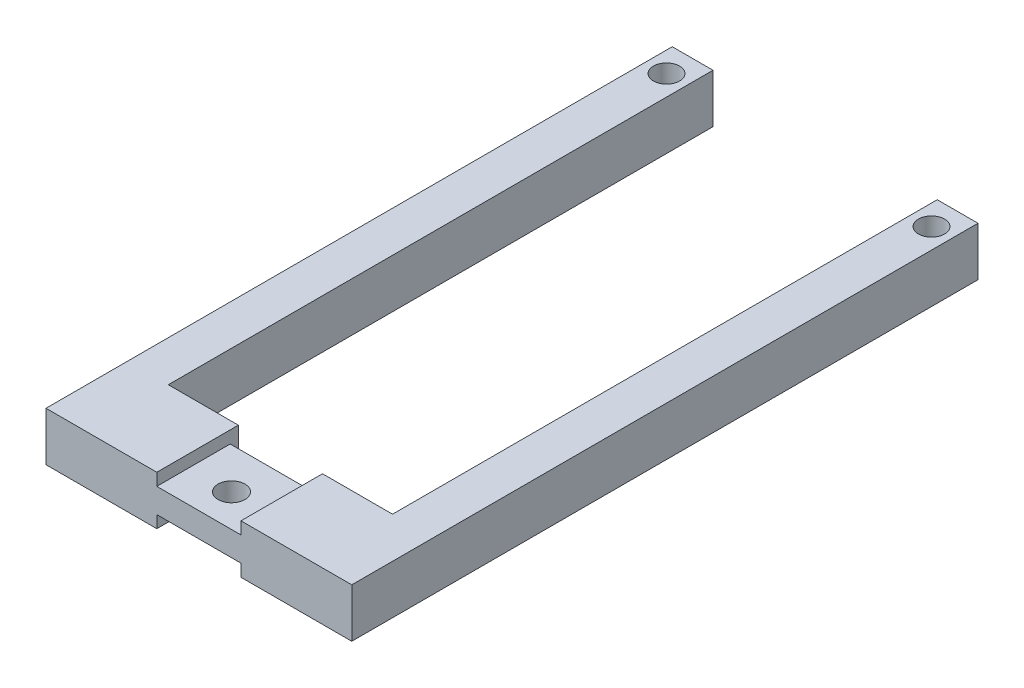
ISO-10303-21;
HEADER;
FILE_DESCRIPTION(('STEP AP214'),'2;1');
FILE_NAME('part.step','',(''),(''),'','','');
FILE_SCHEMA(('AUTOMOTIVE_DESIGN { 1 0 10303 214 1 1 1 1 }'));
ENDSEC;
DATA;
#1=APPLICATION_CONTEXT('core data for automotive mechanical design processes');
#2=APPLICATION_PROTOCOL_DEFINITION('international standard','automotive_design',2000,#1);
#3=PRODUCT_CONTEXT('',#1,'mechanical');
#4=PRODUCT('Part','Part','',(#3));
#5=PRODUCT_RELATED_PRODUCT_CATEGORY('part','',(#4));
#6=PRODUCT_DEFINITION_FORMATION('','',#4);
#7=PRODUCT_DEFINITION_CONTEXT('part definition',#1,'design');
#8=PRODUCT_DEFINITION('design','',#6,#7);
#9=PRODUCT_DEFINITION_SHAPE('','',#8);
#10=(LENGTH_UNIT() NAMED_UNIT(*) SI_UNIT(.MILLI.,.METRE.));
#11=(NAMED_UNIT(*) PLANE_ANGLE_UNIT() SI_UNIT($,.RADIAN.));
#12=(NAMED_UNIT(*) SI_UNIT($,.STERADIAN.) SOLID_ANGLE_UNIT());
#13=UNCERTAINTY_MEASURE_WITH_UNIT(LENGTH_MEASURE(1.E-05),#10,'distance_accuracy_value','');
#14=(GEOMETRIC_REPRESENTATION_CONTEXT(3) GLOBAL_UNCERTAINTY_ASSIGNED_CONTEXT((#13)) GLOBAL_UNIT_ASSIGNED_CONTEXT((#10,
#11,#12)) REPRESENTATION_CONTEXT('',''));
#15=CARTESIAN_POINT('',(0.,0.,0.));
#16=DIRECTION('',(0.,0.,1.));
#17=DIRECTION('',(1.,0.,0.));
#18=AXIS2_PLACEMENT_3D('',#15,#16,#17);
#19=CARTESIAN_POINT('',(-30.5506720736389,8.,45.431484198975));
#20=DIRECTION('',(0.,0.,1.));
#21=DIRECTION('',(1.,0.,0.));
#22=AXIS2_PLACEMENT_3D('',#19,#20,#21);
#23=PLANE('',#22);
#24=DIRECTION('',(0.,-1.,0.));
#25=VECTOR('',#24,1.);
#26=CARTESIAN_POINT('',(-30.5506720736389,8.,45.431484198975));
#27=LINE('',#26,#25);
#28=CARTESIAN_POINT('',(-30.5506720736389,5.5,45.431484198975));
#29=VERTEX_POINT('',#28);
#30=CARTESIAN_POINT('',(-30.5506720736389,2.5,45.431484198975));
#31=VERTEX_POINT('',#30);
#32=EDGE_CURVE('E193',#29,#31,#27,.T.);
#33=ORIENTED_EDGE('',*,*,#32,.F.);
#34=DIRECTION('',(1.,0.,0.));
#35=VECTOR('',#34,1.);
#36=CARTESIAN_POINT('',(-30.5506720736389,5.5,45.431484198975));
#37=LINE('',#36,#35);
#38=CARTESIAN_POINT('',(-20.2306720736389,5.5,45.431484198975));
#39=VERTEX_POINT('',#38);
#40=EDGE_CURVE('E260',#29,#39,#37,.T.);
#41=ORIENTED_EDGE('',*,*,#40,.T.);
#42=DIRECTION('',(0.,-1.,0.));
#43=VECTOR('',#42,1.);
#44=CARTESIAN_POINT('',(-20.2306720736389,8.,45.431484198975));
#45=LINE('',#44,#43);
#46=CARTESIAN_POINT('',(-20.2306720736389,2.5,45.431484198975));
#47=VERTEX_POINT('',#46);
#48=EDGE_CURVE('E187',#39,#47,#45,.T.);
#49=ORIENTED_EDGE('',*,*,#48,.T.);
#50=DIRECTION('',(-1.,0.,0.));
#51=VECTOR('',#50,1.);
#52=CARTESIAN_POINT('',(-30.5506720736389,2.5,45.431484198975));
#53=LINE('',#52,#51);
#54=EDGE_CURVE('E268',#47,#31,#53,.T.);
#55=ORIENTED_EDGE('',*,*,#54,.T.);
#56=EDGE_LOOP('',(#33,#41,#49,#55));
#57=FACE_BOUND('',#56,.T.);
#58=ADVANCED_FACE('F45',(#57),#23,.F.);
#59=CARTESIAN_POINT('',(-42.8906720736389,8.,54.431484198975));
#60=DIRECTION('',(0.,0.,-1.));
#61=DIRECTION('',(-1.,0.,0.));
#62=AXIS2_PLACEMENT_3D('',#59,#60,#61);
#63=PLANE('',#62);
#64=DIRECTION('',(1.,0.,0.));
#65=VECTOR('',#64,1.);
#66=CARTESIAN_POINT('',(-44.8906720736389,0.999999999999991,54.431484198975));
#67=LINE('',#66,#65);
#68=CARTESIAN_POINT('',(-20.2306720736389,0.999999999999991,54.431484198975));
#69=VERTEX_POINT('',#68);
#70=CARTESIAN_POINT('',(-6.64067207363894,0.999999999999987,54.431484198975));
#71=VERTEX_POINT('',#70);
#72=EDGE_CURVE('E249',#69,#71,#67,.T.);
#73=ORIENTED_EDGE('',*,*,#72,.T.);
#74=DIRECTION('',(0.,1.,0.));
#75=VECTOR('',#74,1.);
#76=CARTESIAN_POINT('',(-6.64067207363894,-75.8036620220677,54.431484198975));
#77=LINE('',#76,#75);
#78=CARTESIAN_POINT('',(-6.64067207363894,7.,54.431484198975));
#79=VERTEX_POINT('',#78);
#80=EDGE_CURVE('E317',#71,#79,#77,.T.);
#81=ORIENTED_EDGE('',*,*,#80,.T.);
#82=DIRECTION('',(1.,0.,0.));
#83=VECTOR('',#82,1.);
#84=CARTESIAN_POINT('',(-44.8906720736389,7.,54.431484198975));
#85=LINE('',#84,#83);
#86=CARTESIAN_POINT('',(-20.2306720736389,7.,54.431484198975));
#87=VERTEX_POINT('',#86);
#88=EDGE_CURVE('E253',#87,#79,#85,.T.);
#89=ORIENTED_EDGE('',*,*,#88,.F.);
#90=DIRECTION('',(0.,1.,0.));
#91=VECTOR('',#90,1.);
#92=CARTESIAN_POINT('',(-20.2306720736389,5.6,54.431484198975));
#93=LINE('',#92,#91);
#94=CARTESIAN_POINT('',(-20.2306720736389,5.5,54.431484198975));
#95=VERTEX_POINT('',#94);
#96=EDGE_CURVE('E200',#95,#87,#93,.T.);
#97=ORIENTED_EDGE('',*,*,#96,.F.);
#98=DIRECTION('',(1.,0.,0.));
#99=VECTOR('',#98,1.);
#100=CARTESIAN_POINT('',(-30.5506720736389,5.5,54.431484198975));
#101=LINE('',#100,#99);
#102=CARTESIAN_POINT('',(-30.5506720736389,5.5,54.431484198975));
#103=VERTEX_POINT('',#102);
#104=EDGE_CURVE('E281',#103,#95,#101,.T.);
#105=ORIENTED_EDGE('',*,*,#104,.F.);
#106=DIRECTION('',(0.,1.,0.));
#107=VECTOR('',#106,1.);
#108=CARTESIAN_POINT('',(-30.5506720736389,5.6,54.431484198975));
#109=LINE('',#108,#107);
#110=CARTESIAN_POINT('',(-30.5506720736389,7.,54.431484198975));
#111=VERTEX_POINT('',#110);
#112=EDGE_CURVE('E201',#103,#111,#109,.T.);
#113=ORIENTED_EDGE('',*,*,#112,.T.);
#114=CARTESIAN_POINT('',(-44.1406720736389,7.,54.431484198975));
#115=VERTEX_POINT('',#114);
#116=EDGE_CURVE('E254',#115,#111,#85,.T.);
#117=ORIENTED_EDGE('',*,*,#116,.F.);
#118=DIRECTION('',(0.,1.,0.));
#119=VECTOR('',#118,1.);
#120=CARTESIAN_POINT('',(-44.1406720736389,-75.8036620220677,54.431484198975));
#121=LINE('',#120,#119);
#122=CARTESIAN_POINT('',(-44.1406720736389,0.999999999999987,54.431484198975));
#123=VERTEX_POINT('',#122);
#124=EDGE_CURVE('E69',#123,#115,#121,.T.);
#125=ORIENTED_EDGE('',*,*,#124,.F.);
#126=CARTESIAN_POINT('',(-30.5506720736389,0.999999999999991,54.431484198975));
#127=VERTEX_POINT('',#126);
#128=EDGE_CURVE('E245',#123,#127,#67,.T.);
#129=ORIENTED_EDGE('',*,*,#128,.T.);
#130=DIRECTION('',(0.,-1.,0.));
#131=VECTOR('',#130,1.);
#132=CARTESIAN_POINT('',(-30.5506720736389,2.4,54.431484198975));
#133=LINE('',#132,#131);
#134=CARTESIAN_POINT('',(-30.5506720736389,2.5,54.431484198975));
#135=VERTEX_POINT('',#134);
#136=EDGE_CURVE('E205',#135,#127,#133,.T.);
#137=ORIENTED_EDGE('',*,*,#136,.F.);
#138=DIRECTION('',(-1.,0.,0.));
#139=VECTOR('',#138,1.);
#140=CARTESIAN_POINT('',(-30.5506720736389,2.5,54.431484198975));
#141=LINE('',#140,#139);
#142=CARTESIAN_POINT('',(-20.2306720736389,2.5,54.431484198975));
#143=VERTEX_POINT('',#142);
#144=EDGE_CURVE('E277',#143,#135,#141,.T.);
#145=ORIENTED_EDGE('',*,*,#144,.F.);
#146=DIRECTION('',(0.,-1.,0.));
#147=VECTOR('',#146,1.);
#148=CARTESIAN_POINT('',(-20.2306720736389,2.4,54.431484198975));
#149=LINE('',#148,#147);
#150=EDGE_CURVE('E209',#143,#69,#149,.T.);
#151=ORIENTED_EDGE('',*,*,#150,.T.);
#152=EDGE_LOOP('',(#73,#81,#89,#97,#105,#113,#117,#125,#129,#137,#145,#151));
#153=FACE_BOUND('',#152,.T.);
#154=ADVANCED_FACE('F47',(#153),#63,.F.);
#155=CARTESIAN_POINT('',(-20.2306720736389,8.,44.431484198975));
#156=DIRECTION('',(0.,0.,1.));
#157=DIRECTION('',(1.,0.,0.));
#158=AXIS2_PLACEMENT_3D('',#155,#156,#157);
#159=PLANE('',#158);
#160=DIRECTION('',(0.,-1.,0.));
#161=VECTOR('',#160,1.);
#162=CARTESIAN_POINT('',(-20.2306720736389,8.,44.431484198975));
#163=LINE('',#162,#161);
#164=CARTESIAN_POINT('',(-20.2306720736389,7.,44.431484198975));
#165=VERTEX_POINT('',#164);
#166=CARTESIAN_POINT('',(-20.2306720736389,0.99999999999999,44.431484198975));
#167=VERTEX_POINT('',#166);
#168=EDGE_CURVE('E185',#165,#167,#163,.T.);
#169=ORIENTED_EDGE('',*,*,#168,.F.);
#170=DIRECTION('',(1.,0.,0.));
#171=VECTOR('',#170,1.);
#172=CARTESIAN_POINT('',(-20.2306720736389,7.,44.431484198975));
#173=LINE('',#172,#171);
#174=CARTESIAN_POINT('',(-11.6406720736389,7.,44.431484198975));
#175=VERTEX_POINT('',#174);
#176=EDGE_CURVE('E213',#165,#175,#173,.T.);
#177=ORIENTED_EDGE('',*,*,#176,.T.);
#178=DIRECTION('',(0.,1.,0.));
#179=VECTOR('',#178,1.);
#180=CARTESIAN_POINT('',(-11.6406720736389,-75.8036620220677,44.431484198975));
#181=LINE('',#180,#179);
#182=CARTESIAN_POINT('',(-11.6406720736389,0.999999999999987,44.431484198975));
#183=VERTEX_POINT('',#182);
#184=EDGE_CURVE('E171',#183,#175,#181,.T.);
#185=ORIENTED_EDGE('',*,*,#184,.F.);
#186=DIRECTION('',(-1.,0.,0.));
#187=VECTOR('',#186,1.);
#188=CARTESIAN_POINT('',(-20.2306720736389,0.99999999999999,44.431484198975));
#189=LINE('',#188,#187);
#190=EDGE_CURVE('E179',#183,#167,#189,.T.);
#191=ORIENTED_EDGE('',*,*,#190,.T.);
#192=EDGE_LOOP('',(#169,#177,#185,#191));
#193=FACE_BOUND('',#192,.T.);
#194=ADVANCED_FACE('F413',(#193),#159,.F.);
#195=CARTESIAN_POINT('',(-20.2306720736389,8.,45.431484198975));
#196=DIRECTION('',(1.,0.,0.));
#197=DIRECTION('',(0.,0.,-1.));
#198=AXIS2_PLACEMENT_3D('',#195,#196,#197);
#199=PLANE('',#198);
#200=ORIENTED_EDGE('',*,*,#48,.F.);
#201=DIRECTION('',(0.,0.,1.));
#202=VECTOR('',#201,1.);
#203=CARTESIAN_POINT('',(-20.2306720736389,5.5,44.431484198975));
#204=LINE('',#203,#202);
#205=EDGE_CURVE('E276',#39,#95,#204,.T.);
#206=ORIENTED_EDGE('',*,*,#205,.T.);
#207=ORIENTED_EDGE('',*,*,#96,.T.);
#208=DIRECTION('',(0.,0.,-1.));
#209=VECTOR('',#208,1.);
#210=CARTESIAN_POINT('',(-20.2306720736389,7.,45.431484198975));
#211=LINE('',#210,#209);
#212=EDGE_CURVE('E219',#87,#165,#211,.T.);
#213=ORIENTED_EDGE('',*,*,#212,.T.);
#214=ORIENTED_EDGE('',*,*,#168,.T.);
#215=DIRECTION('',(0.,0.,1.));
#216=VECTOR('',#215,1.);
#217=CARTESIAN_POINT('',(-20.2306720736389,0.99999999999999,45.431484198975));
#218=LINE('',#217,#216);
#219=EDGE_CURVE('E233',#167,#69,#218,.T.);
#220=ORIENTED_EDGE('',*,*,#219,.T.);
#221=ORIENTED_EDGE('',*,*,#150,.F.);
#222=DIRECTION('',(0.,0.,1.));
#223=VECTOR('',#222,1.);
#224=CARTESIAN_POINT('',(-20.2306720736389,2.5,44.431484198975));
#225=LINE('',#224,#223);
#226=EDGE_CURVE('E282',#47,#143,#225,.T.);
#227=ORIENTED_EDGE('',*,*,#226,.F.);
#228=EDGE_LOOP('',(#200,#206,#207,#213,#214,#220,#221,#227));
#229=FACE_BOUND('',#228,.T.);
#230=ADVANCED_FACE('F418',(#229),#199,.F.);
#231=CARTESIAN_POINT('',(-30.5506720736389,8.,44.431484198975));
#232=DIRECTION('',(-1.,0.,0.));
#233=DIRECTION('',(0.,0.,1.));
#234=AXIS2_PLACEMENT_3D('',#231,#232,#233);
#235=PLANE('',#234);
#236=DIRECTION('',(0.,0.,1.));
#237=VECTOR('',#236,1.);
#238=CARTESIAN_POINT('',(-30.5506720736389,5.5,44.431484198975));
#239=LINE('',#238,#237);
#240=EDGE_CURVE('E291',#29,#103,#239,.T.);
#241=ORIENTED_EDGE('',*,*,#240,.F.);
#242=ORIENTED_EDGE('',*,*,#32,.T.);
#243=DIRECTION('',(0.,0.,1.));
#244=VECTOR('',#243,1.);
#245=CARTESIAN_POINT('',(-30.5506720736389,2.5,44.431484198975));
#246=LINE('',#245,#244);
#247=EDGE_CURVE('E283',#31,#135,#246,.T.);
#248=ORIENTED_EDGE('',*,*,#247,.T.);
#249=ORIENTED_EDGE('',*,*,#136,.T.);
#250=DIRECTION('',(0.,0.,-1.));
#251=VECTOR('',#250,1.);
#252=CARTESIAN_POINT('',(-30.5506720736389,0.99999999999999,44.431484198975));
#253=LINE('',#252,#251);
#254=CARTESIAN_POINT('',(-30.5506720736389,0.99999999999999,44.431484198975));
#255=VERTEX_POINT('',#254);
#256=EDGE_CURVE('E237',#127,#255,#253,.T.);
#257=ORIENTED_EDGE('',*,*,#256,.T.);
#258=DIRECTION('',(0.,-1.,0.));
#259=VECTOR('',#258,1.);
#260=CARTESIAN_POINT('',(-30.5506720736389,8.,44.431484198975));
#261=LINE('',#260,#259);
#262=CARTESIAN_POINT('',(-30.5506720736389,7.,44.431484198975));
#263=VERTEX_POINT('',#262);
#264=EDGE_CURVE('E197',#263,#255,#261,.T.);
#265=ORIENTED_EDGE('',*,*,#264,.F.);
#266=DIRECTION('',(0.,0.,1.));
#267=VECTOR('',#266,1.);
#268=CARTESIAN_POINT('',(-30.5506720736389,7.,44.431484198975));
#269=LINE('',#268,#267);
#270=EDGE_CURVE('E223',#263,#111,#269,.T.);
#271=ORIENTED_EDGE('',*,*,#270,.T.);
#272=ORIENTED_EDGE('',*,*,#112,.F.);
#273=EDGE_LOOP('',(#241,#242,#248,#249,#257,#265,#271,#272));
#274=FACE_BOUND('',#273,.T.);
#275=ADVANCED_FACE('F382',(#274),#235,.F.);
#276=CARTESIAN_POINT('',(-37.8906720736389,8.,44.431484198975));
#277=DIRECTION('',(0.,0.,1.));
#278=DIRECTION('',(1.,0.,0.));
#279=AXIS2_PLACEMENT_3D('',#276,#277,#278);
#280=PLANE('',#279);
#281=DIRECTION('',(-1.,0.,0.));
#282=VECTOR('',#281,1.);
#283=CARTESIAN_POINT('',(-37.8906720736389,0.99999999999999,44.431484198975));
#284=LINE('',#283,#282);
#285=CARTESIAN_POINT('',(-39.1406720736389,0.999999999999987,44.431484198975));
#286=VERTEX_POINT('',#285);
#287=EDGE_CURVE('E241',#255,#286,#284,.T.);
#288=ORIENTED_EDGE('',*,*,#287,.T.);
#289=DIRECTION('',(0.,1.,0.));
#290=VECTOR('',#289,1.);
#291=CARTESIAN_POINT('',(-39.1406720736389,-75.8036620220677,44.431484198975));
#292=LINE('',#291,#290);
#293=CARTESIAN_POINT('',(-39.1406720736389,7.,44.431484198975));
#294=VERTEX_POINT('',#293);
#295=EDGE_CURVE('E304',#286,#294,#292,.T.);
#296=ORIENTED_EDGE('',*,*,#295,.T.);
#297=DIRECTION('',(1.,0.,0.));
#298=VECTOR('',#297,1.);
#299=CARTESIAN_POINT('',(-37.8906720736389,7.,44.431484198975));
#300=LINE('',#299,#298);
#301=EDGE_CURVE('E227',#294,#263,#300,.T.);
#302=ORIENTED_EDGE('',*,*,#301,.T.);
#303=ORIENTED_EDGE('',*,*,#264,.T.);
#304=EDGE_LOOP('',(#288,#296,#302,#303));
#305=FACE_BOUND('',#304,.T.);
#306=ADVANCED_FACE('F384',(#305),#280,.F.);
#307=CARTESIAN_POINT('',(-44.8906720736389,85.1183506047685,-22.368515801025));
#308=DIRECTION('',(0.,0.,-1.));
#309=DIRECTION('',(-1.,0.,0.));
#310=AXIS2_PLACEMENT_3D('',#307,#308,#309);
#311=PLANE('',#310);
#312=DIRECTION('',(0.,1.,0.));
#313=VECTOR('',#312,1.);
#314=CARTESIAN_POINT('',(-44.1406720736389,-75.8036620220677,-22.368515801025));
#315=LINE('',#314,#313);
#316=CARTESIAN_POINT('',(-44.1406720736389,0.999999999999987,-22.368515801025));
#317=VERTEX_POINT('',#316);
#318=CARTESIAN_POINT('',(-44.1406720736389,7.,-22.368515801025));
#319=VERTEX_POINT('',#318);
#320=EDGE_CURVE('E330',#317,#319,#315,.T.);
#321=ORIENTED_EDGE('',*,*,#320,.T.);
#322=DIRECTION('',(1.,0.,0.));
#323=VECTOR('',#322,1.);
#324=CARTESIAN_POINT('',(-44.8906720736389,7.,-22.368515801025));
#325=LINE('',#324,#323);
#326=CARTESIAN_POINT('',(-39.140672073639,7.,-22.368515801025));
#327=VERTEX_POINT('',#326);
#328=EDGE_CURVE('E244',#319,#327,#325,.T.);
#329=ORIENTED_EDGE('',*,*,#328,.T.);
#330=DIRECTION('',(0.,1.,0.));
#331=VECTOR('',#330,1.);
#332=CARTESIAN_POINT('',(-39.140672073639,-75.8036620220677,-22.368515801025));
#333=LINE('',#332,#331);
#334=CARTESIAN_POINT('',(-39.140672073639,0.999999999999987,-22.368515801025));
#335=VERTEX_POINT('',#334);
#336=EDGE_CURVE('E301',#335,#327,#333,.T.);
#337=ORIENTED_EDGE('',*,*,#336,.F.);
#338=DIRECTION('',(1.,0.,0.));
#339=VECTOR('',#338,1.);
#340=CARTESIAN_POINT('',(-44.8906720736389,0.999999999999991,-22.368515801025));
#341=LINE('',#340,#339);
#342=EDGE_CURVE('E248',#317,#335,#341,.T.);
#343=ORIENTED_EDGE('',*,*,#342,.F.);
#344=EDGE_LOOP('',(#321,#329,#337,#343));
#345=FACE_BOUND('',#344,.T.);
#346=ADVANCED_FACE('F392',(#345),#311,.T.);
#347=CARTESIAN_POINT('',(-5.89067207363895,85.1183506047685,-22.368515801025));
#348=DIRECTION('',(0.,0.,-1.));
#349=DIRECTION('',(-1.,0.,0.));
#350=AXIS2_PLACEMENT_3D('',#347,#348,#349);
#351=PLANE('',#350);
#352=DIRECTION('',(0.,1.,0.));
#353=VECTOR('',#352,1.);
#354=CARTESIAN_POINT('',(-6.64067207363896,-75.8036620220677,-22.368515801025));
#355=LINE('',#354,#353);
#356=CARTESIAN_POINT('',(-6.64067207363896,0.999999999999987,-22.368515801025));
#357=VERTEX_POINT('',#356);
#358=CARTESIAN_POINT('',(-6.64067207363896,6.99999999999999,-22.368515801025));
#359=VERTEX_POINT('',#358);
#360=EDGE_CURVE('E61',#357,#359,#355,.T.);
#361=ORIENTED_EDGE('',*,*,#360,.F.);
#362=DIRECTION('',(1.,0.,0.));
#363=VECTOR('',#362,1.);
#364=CARTESIAN_POINT('',(-5.89067207363895,0.999999999999987,-22.368515801025));
#365=LINE('',#364,#363);
#366=CARTESIAN_POINT('',(-11.6406720736389,0.999999999999987,-22.368515801025));
#367=VERTEX_POINT('',#366);
#368=EDGE_CURVE('E54',#367,#357,#365,.T.);
#369=ORIENTED_EDGE('',*,*,#368,.F.);
#370=DIRECTION('',(0.,1.,0.));
#371=VECTOR('',#370,1.);
#372=CARTESIAN_POINT('',(-11.6406720736389,-75.8036620220677,-22.368515801025));
#373=LINE('',#372,#371);
#374=CARTESIAN_POINT('',(-11.6406720736389,7.,-22.368515801025));
#375=VERTEX_POINT('',#374);
#376=EDGE_CURVE('E159',#367,#375,#373,.T.);
#377=ORIENTED_EDGE('',*,*,#376,.T.);
#378=DIRECTION('',(-1.,0.,0.));
#379=VECTOR('',#378,1.);
#380=CARTESIAN_POINT('',(-5.89067207363895,6.99999999999999,-22.368515801025));
#381=LINE('',#380,#379);
#382=EDGE_CURVE('E11',#359,#375,#381,.T.);
#383=ORIENTED_EDGE('',*,*,#382,.F.);
#384=EDGE_LOOP('',(#361,#369,#377,#383));
#385=FACE_BOUND('',#384,.T.);
#386=ADVANCED_FACE('F183',(#385),#351,.T.);
#387=CARTESIAN_POINT('',(-44.8906720736389,0.999999999999991,54.431484198975));
#388=DIRECTION('',(0.,1.,0.));
#389=DIRECTION('',(0.,0.,1.));
#390=AXIS2_PLACEMENT_3D('',#387,#388,#389);
#391=PLANE('',#390);
#392=CARTESIAN_POINT('',(-9.14067207363895,0.999999999999987,-19.168515801025));
#393=DIRECTION('',(0.,1.,0.));
#394=DIRECTION('',(0.,0.,1.));
#395=AXIS2_PLACEMENT_3D('',#392,#393,#394);
#396=CIRCLE('',#395,1.6);
#397=CARTESIAN_POINT('',(-9.14067207363895,0.999999999999987,-17.568515801025));
#398=VERTEX_POINT('',#397);
#399=EDGE_CURVE('E321',#398,#398,#396,.F.);
#400=ORIENTED_EDGE('',*,*,#399,.F.);
#401=EDGE_LOOP('',(#400));
#402=FACE_BOUND('',#401,.T.);
#403=ORIENTED_EDGE('',*,*,#368,.T.);
#404=DIRECTION('',(0.,0.,-1.));
#405=VECTOR('',#404,1.);
#406=CARTESIAN_POINT('',(-6.64067207363896,0.999999999999987,-22.368515801025));
#407=LINE('',#406,#405);
#408=EDGE_CURVE('E314',#71,#357,#407,.T.);
#409=ORIENTED_EDGE('',*,*,#408,.F.);
#410=ORIENTED_EDGE('',*,*,#72,.F.);
#411=ORIENTED_EDGE('',*,*,#219,.F.);
#412=ORIENTED_EDGE('',*,*,#190,.F.);
#413=DIRECTION('',(0.,0.,1.));
#414=VECTOR('',#413,1.);
#415=CARTESIAN_POINT('',(-11.6406720736389,0.999999999999987,-22.368515801025));
#416=LINE('',#415,#414);
#417=EDGE_CURVE('E163',#367,#183,#416,.T.);
#418=ORIENTED_EDGE('',*,*,#417,.F.);
#419=EDGE_LOOP('',(#403,#409,#410,#411,#412,#418));
#420=FACE_BOUND('',#419,.T.);
#421=ADVANCED_FACE('F175',(#402,#420),#391,.F.);
#422=CARTESIAN_POINT('',(-44.8906720736389,7.,54.431484198975));
#423=DIRECTION('',(0.,-1.,0.));
#424=DIRECTION('',(0.,0.,-1.));
#425=AXIS2_PLACEMENT_3D('',#422,#423,#424);
#426=PLANE('',#425);
#427=CARTESIAN_POINT('',(-9.14067207363895,7.,-19.168515801025));
#428=DIRECTION('',(0.,1.,0.));
#429=DIRECTION('',(0.,0.,-1.));
#430=AXIS2_PLACEMENT_3D('',#427,#428,#429);
#431=CIRCLE('',#430,1.6);
#432=CARTESIAN_POINT('',(-9.14067207363895,7.,-20.768515801025));
#433=VERTEX_POINT('',#432);
#434=EDGE_CURVE('E343',#433,#433,#431,.T.);
#435=ORIENTED_EDGE('',*,*,#434,.F.);
#436=EDGE_LOOP('',(#435));
#437=FACE_BOUND('',#436,.T.);
#438=ORIENTED_EDGE('',*,*,#88,.T.);
#439=DIRECTION('',(0.,0.,1.));
#440=VECTOR('',#439,1.);
#441=CARTESIAN_POINT('',(-6.64067207363896,7.,-22.368515801025));
#442=LINE('',#441,#440);
#443=EDGE_CURVE('E318',#359,#79,#442,.T.);
#444=ORIENTED_EDGE('',*,*,#443,.F.);
#445=ORIENTED_EDGE('',*,*,#382,.T.);
#446=DIRECTION('',(0.,0.,-1.));
#447=VECTOR('',#446,1.);
#448=CARTESIAN_POINT('',(-11.6406720736389,7.,-22.368515801025));
#449=LINE('',#448,#447);
#450=EDGE_CURVE('E166',#175,#375,#449,.T.);
#451=ORIENTED_EDGE('',*,*,#450,.F.);
#452=ORIENTED_EDGE('',*,*,#176,.F.);
#453=ORIENTED_EDGE('',*,*,#212,.F.);
#454=EDGE_LOOP('',(#438,#444,#445,#451,#452,#453));
#455=FACE_BOUND('',#454,.T.);
#456=ADVANCED_FACE('F365',(#437,#455),#426,.F.);
#457=CARTESIAN_POINT('',(-41.640672073639,0.999999999999987,-19.168515801025));
#458=DIRECTION('',(0.,1.,0.));
#459=DIRECTION('',(0.,0.,1.));
#460=AXIS2_PLACEMENT_3D('',#457,#458,#459);
#461=CIRCLE('',#460,1.6);
#462=CARTESIAN_POINT('',(-41.640672073639,0.999999999999987,-17.568515801025));
#463=VERTEX_POINT('',#462);
#464=EDGE_CURVE('E347',#463,#463,#461,.F.);
#465=ORIENTED_EDGE('',*,*,#464,.F.);
#466=EDGE_LOOP('',(#465));
#467=FACE_BOUND('',#466,.T.);
#468=ORIENTED_EDGE('',*,*,#128,.F.);
#469=DIRECTION('',(0.,0.,1.));
#470=VECTOR('',#469,1.);
#471=CARTESIAN_POINT('',(-44.1406720736389,0.999999999999987,-22.368515801025));
#472=LINE('',#471,#470);
#473=EDGE_CURVE('E327',#317,#123,#472,.T.);
#474=ORIENTED_EDGE('',*,*,#473,.F.);
#475=ORIENTED_EDGE('',*,*,#342,.T.);
#476=DIRECTION('',(0.,0.,-1.));
#477=VECTOR('',#476,1.);
#478=CARTESIAN_POINT('',(-39.140672073639,0.999999999999987,-22.368515801025));
#479=LINE('',#478,#477);
#480=EDGE_CURVE('E287',#286,#335,#479,.T.);
#481=ORIENTED_EDGE('',*,*,#480,.F.);
#482=ORIENTED_EDGE('',*,*,#287,.F.);
#483=ORIENTED_EDGE('',*,*,#256,.F.);
#484=EDGE_LOOP('',(#468,#474,#475,#481,#482,#483));
#485=FACE_BOUND('',#484,.T.);
#486=ADVANCED_FACE('F361',(#467,#485),#391,.F.);
#487=CARTESIAN_POINT('',(-41.640672073639,7.,-19.168515801025));
#488=DIRECTION('',(0.,1.,0.));
#489=DIRECTION('',(0.,0.,1.));
#490=AXIS2_PLACEMENT_3D('',#487,#488,#489);
#491=CIRCLE('',#490,1.6);
#492=CARTESIAN_POINT('',(-41.640672073639,7.,-17.568515801025));
#493=VERTEX_POINT('',#492);
#494=EDGE_CURVE('E331',#493,#493,#491,.T.);
#495=ORIENTED_EDGE('',*,*,#494,.F.);
#496=EDGE_LOOP('',(#495));
#497=FACE_BOUND('',#496,.T.);
#498=ORIENTED_EDGE('',*,*,#328,.F.);
#499=DIRECTION('',(0.,0.,-1.));
#500=VECTOR('',#499,1.);
#501=CARTESIAN_POINT('',(-44.1406720736389,7.,-22.368515801025));
#502=LINE('',#501,#500);
#503=EDGE_CURVE('E181',#115,#319,#502,.T.);
#504=ORIENTED_EDGE('',*,*,#503,.F.);
#505=ORIENTED_EDGE('',*,*,#116,.T.);
#506=ORIENTED_EDGE('',*,*,#270,.F.);
#507=ORIENTED_EDGE('',*,*,#301,.F.);
#508=DIRECTION('',(0.,0.,1.));
#509=VECTOR('',#508,1.);
#510=CARTESIAN_POINT('',(-39.140672073639,7.,-22.368515801025));
#511=LINE('',#510,#509);
#512=EDGE_CURVE('E305',#327,#294,#511,.T.);
#513=ORIENTED_EDGE('',*,*,#512,.F.);
#514=EDGE_LOOP('',(#498,#504,#505,#506,#507,#513));
#515=FACE_BOUND('',#514,.T.);
#516=ADVANCED_FACE('F364',(#497,#515),#426,.F.);
#517=CARTESIAN_POINT('',(-30.5506720736389,2.5,44.431484198975));
#518=DIRECTION('',(0.,1.,0.));
#519=DIRECTION('',(0.,0.,1.));
#520=AXIS2_PLACEMENT_3D('',#517,#518,#519);
#521=PLANE('',#520);
#522=CARTESIAN_POINT('',(-25.3906720736389,2.5,50.431484198975));
#523=DIRECTION('',(0.,1.,0.));
#524=DIRECTION('',(0.,0.,1.));
#525=AXIS2_PLACEMENT_3D('',#522,#523,#524);
#526=CIRCLE('',#525,1.65);
#527=CARTESIAN_POINT('',(-25.3906720736389,2.5,52.081484198975));
#528=VERTEX_POINT('',#527);
#529=EDGE_CURVE('E272',#528,#528,#526,.T.);
#530=ORIENTED_EDGE('',*,*,#529,.T.);
#531=EDGE_LOOP('',(#530));
#532=FACE_BOUND('',#531,.T.);
#533=ORIENTED_EDGE('',*,*,#226,.T.);
#534=ORIENTED_EDGE('',*,*,#144,.T.);
#535=ORIENTED_EDGE('',*,*,#247,.F.);
#536=ORIENTED_EDGE('',*,*,#54,.F.);
#537=EDGE_LOOP('',(#533,#534,#535,#536));
#538=FACE_BOUND('',#537,.T.);
#539=ADVANCED_FACE('F436',(#532,#538),#521,.F.);
#540=CARTESIAN_POINT('',(-30.5506720736389,5.5,44.431484198975));
#541=DIRECTION('',(0.,-1.,0.));
#542=DIRECTION('',(0.,0.,-1.));
#543=AXIS2_PLACEMENT_3D('',#540,#541,#542);
#544=PLANE('',#543);
#545=CARTESIAN_POINT('',(-25.3906720736389,5.5,50.431484198975));
#546=DIRECTION('',(0.,-1.,0.));
#547=DIRECTION('',(0.,0.,-1.));
#548=AXIS2_PLACEMENT_3D('',#545,#546,#547);
#549=CIRCLE('',#548,1.65);
#550=CARTESIAN_POINT('',(-25.3906720736389,5.5,48.781484198975));
#551=VERTEX_POINT('',#550);
#552=EDGE_CURVE('E264',#551,#551,#549,.T.);
#553=ORIENTED_EDGE('',*,*,#552,.T.);
#554=EDGE_LOOP('',(#553));
#555=FACE_BOUND('',#554,.T.);
#556=ORIENTED_EDGE('',*,*,#240,.T.);
#557=ORIENTED_EDGE('',*,*,#104,.T.);
#558=ORIENTED_EDGE('',*,*,#205,.F.);
#559=ORIENTED_EDGE('',*,*,#40,.F.);
#560=EDGE_LOOP('',(#556,#557,#558,#559));
#561=FACE_BOUND('',#560,.T.);
#562=ADVANCED_FACE('F434',(#555,#561),#544,.F.);
#563=CARTESIAN_POINT('',(-25.3906720736389,8.,50.431484198975));
#564=DIRECTION('',(0.,-1.,0.));
#565=DIRECTION('',(0.,0.,-1.));
#566=AXIS2_PLACEMENT_3D('',#563,#564,#565);
#567=CYLINDRICAL_SURFACE('',#566,1.65);
#568=ORIENTED_EDGE('',*,*,#552,.F.);
#569=EDGE_LOOP('',(#568));
#570=FACE_BOUND('',#569,.T.);
#571=ORIENTED_EDGE('',*,*,#529,.F.);
#572=EDGE_LOOP('',(#571));
#573=FACE_BOUND('',#572,.T.);
#574=ADVANCED_FACE('F444',(#570,#573),#567,.F.);
#575=CARTESIAN_POINT('',(-39.140672073639,-75.8036620220677,-22.368515801025));
#576=DIRECTION('',(-1.,0.,0.));
#577=DIRECTION('',(0.,0.,1.));
#578=AXIS2_PLACEMENT_3D('',#575,#576,#577);
#579=PLANE('',#578);
#580=ORIENTED_EDGE('',*,*,#480,.T.);
#581=ORIENTED_EDGE('',*,*,#336,.T.);
#582=ORIENTED_EDGE('',*,*,#512,.T.);
#583=ORIENTED_EDGE('',*,*,#295,.F.);
#584=EDGE_LOOP('',(#580,#581,#582,#583));
#585=FACE_BOUND('',#584,.T.);
#586=ADVANCED_FACE('F389',(#585),#579,.F.);
#587=CARTESIAN_POINT('',(-41.640672073639,-75.8036620220677,-19.168515801025));
#588=DIRECTION('',(0.,1.,0.));
#589=DIRECTION('',(0.,0.,1.));
#590=AXIS2_PLACEMENT_3D('',#587,#588,#589);
#591=CYLINDRICAL_SURFACE('',#590,1.6);
#592=ORIENTED_EDGE('',*,*,#464,.T.);
#593=EDGE_LOOP('',(#592));
#594=FACE_BOUND('',#593,.T.);
#595=ORIENTED_EDGE('',*,*,#494,.T.);
#596=EDGE_LOOP('',(#595));
#597=FACE_BOUND('',#596,.T.);
#598=ADVANCED_FACE('F358',(#594,#597),#591,.F.);
#599=CARTESIAN_POINT('',(-44.1406720736389,-75.8036620220677,-22.368515801025));
#600=DIRECTION('',(1.,0.,0.));
#601=DIRECTION('',(0.,0.,-1.));
#602=AXIS2_PLACEMENT_3D('',#599,#600,#601);
#603=PLANE('',#602);
#604=ORIENTED_EDGE('',*,*,#473,.T.);
#605=ORIENTED_EDGE('',*,*,#124,.T.);
#606=ORIENTED_EDGE('',*,*,#503,.T.);
#607=ORIENTED_EDGE('',*,*,#320,.F.);
#608=EDGE_LOOP('',(#604,#605,#606,#607));
#609=FACE_BOUND('',#608,.T.);
#610=ADVANCED_FACE('F393',(#609),#603,.F.);
#611=CARTESIAN_POINT('',(-9.14067207363895,-75.8036620220677,-19.168515801025));
#612=DIRECTION('',(0.,1.,0.));
#613=DIRECTION('',(0.,0.,1.));
#614=AXIS2_PLACEMENT_3D('',#611,#612,#613);
#615=CYLINDRICAL_SURFACE('',#614,1.6);
#616=ORIENTED_EDGE('',*,*,#399,.T.);
#617=EDGE_LOOP('',(#616));
#618=FACE_BOUND('',#617,.T.);
#619=ORIENTED_EDGE('',*,*,#434,.T.);
#620=EDGE_LOOP('',(#619));
#621=FACE_BOUND('',#620,.T.);
#622=ADVANCED_FACE('F395',(#618,#621),#615,.F.);
#623=CARTESIAN_POINT('',(-11.6406720736389,-75.8036620220677,-22.368515801025));
#624=DIRECTION('',(1.,0.,0.));
#625=DIRECTION('',(0.,0.,-1.));
#626=AXIS2_PLACEMENT_3D('',#623,#624,#625);
#627=PLANE('',#626);
#628=ORIENTED_EDGE('',*,*,#417,.T.);
#629=ORIENTED_EDGE('',*,*,#184,.T.);
#630=ORIENTED_EDGE('',*,*,#450,.T.);
#631=ORIENTED_EDGE('',*,*,#376,.F.);
#632=EDGE_LOOP('',(#628,#629,#630,#631));
#633=FACE_BOUND('',#632,.T.);
#634=ADVANCED_FACE('F161',(#633),#627,.F.);
#635=CARTESIAN_POINT('',(-6.64067207363896,-75.8036620220677,-22.368515801025));
#636=DIRECTION('',(-1.,0.,0.));
#637=DIRECTION('',(0.,0.,1.));
#638=AXIS2_PLACEMENT_3D('',#635,#636,#637);
#639=PLANE('',#638);
#640=ORIENTED_EDGE('',*,*,#408,.T.);
#641=ORIENTED_EDGE('',*,*,#360,.T.);
#642=ORIENTED_EDGE('',*,*,#443,.T.);
#643=ORIENTED_EDGE('',*,*,#80,.F.);
#644=EDGE_LOOP('',(#640,#641,#642,#643));
#645=FACE_BOUND('',#644,.T.);
#646=ADVANCED_FACE('F566',(#645),#639,.F.);
#647=CLOSED_SHELL('',(#58,#154,#194,#230,#275,#306,#346,#386,#421,#456,#486,#516,#539,#562,#574,
#586,#598,#610,#622,#634,#646));
#648=MANIFOLD_SOLID_BREP('B2',#647);
#649=ADVANCED_BREP_SHAPE_REPRESENTATION('',(#18,#648),#14);
#650=SHAPE_DEFINITION_REPRESENTATION(#9,#649);
ENDSEC;
END-ISO-10303-21;
